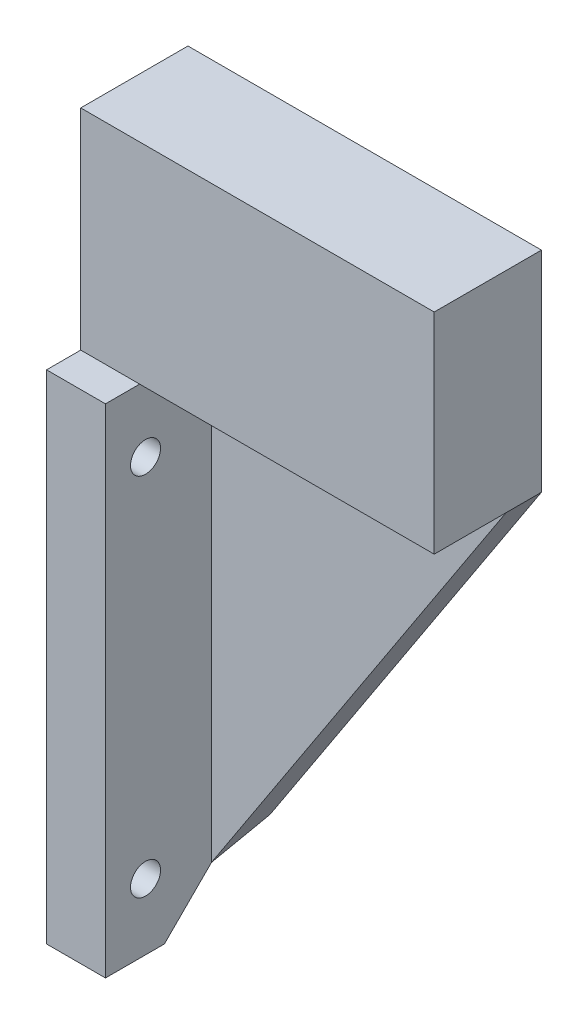
ISO-10303-21;
HEADER;
FILE_DESCRIPTION(('STEP AP214'),'2;1');
FILE_NAME('part.step','',(''),(''),'','','');
FILE_SCHEMA(('AUTOMOTIVE_DESIGN { 1 0 10303 214 1 1 1 1 }'));
ENDSEC;
DATA;
#1=APPLICATION_CONTEXT('core data for automotive mechanical design processes');
#2=APPLICATION_PROTOCOL_DEFINITION('international standard','automotive_design',2000,#1);
#3=PRODUCT_CONTEXT('',#1,'mechanical');
#4=PRODUCT('Part','Part','',(#3));
#5=PRODUCT_RELATED_PRODUCT_CATEGORY('part','',(#4));
#6=PRODUCT_DEFINITION_FORMATION('','',#4);
#7=PRODUCT_DEFINITION_CONTEXT('part definition',#1,'design');
#8=PRODUCT_DEFINITION('design','',#6,#7);
#9=PRODUCT_DEFINITION_SHAPE('','',#8);
#10=(LENGTH_UNIT() NAMED_UNIT(*) SI_UNIT(.MILLI.,.METRE.));
#11=(NAMED_UNIT(*) PLANE_ANGLE_UNIT() SI_UNIT($,.RADIAN.));
#12=(NAMED_UNIT(*) SI_UNIT($,.STERADIAN.) SOLID_ANGLE_UNIT());
#13=UNCERTAINTY_MEASURE_WITH_UNIT(LENGTH_MEASURE(1.E-05),#10,'distance_accuracy_value','');
#14=(GEOMETRIC_REPRESENTATION_CONTEXT(3) GLOBAL_UNCERTAINTY_ASSIGNED_CONTEXT((#13)) GLOBAL_UNIT_ASSIGNED_CONTEXT((#10,
#11,#12)) REPRESENTATION_CONTEXT('',''));
#15=CARTESIAN_POINT('',(0.,0.,0.));
#16=DIRECTION('',(0.,0.,1.));
#17=DIRECTION('',(1.,0.,0.));
#18=AXIS2_PLACEMENT_3D('',#15,#16,#17);
#19=CARTESIAN_POINT('',(5.,-14.8984585562319,-14.8984585562319));
#20=DIRECTION('',(0.,0.707106781186548,0.707106781186548));
#21=DIRECTION('',(0.,-0.707106781186548,0.707106781186548));
#22=AXIS2_PLACEMENT_3D('',#19,#20,#21);
#23=PLANE('',#22);
#24=DIRECTION('',(0.,0.707106781186548,-0.707106781186548));
#25=VECTOR('',#24,1.);
#26=CARTESIAN_POINT('',(0.,-14.8984585562319,-14.8984585562319));
#27=LINE('',#26,#25);
#28=CARTESIAN_POINT('',(0.,-34.1785648404354,4.38164772797147));
#29=VERTEX_POINT('',#28);
#30=CARTESIAN_POINT('',(0.,-27.1795648404353,-2.61735227202852));
#31=VERTEX_POINT('',#30);
#32=EDGE_CURVE('E130',#29,#31,#27,.T.);
#33=ORIENTED_EDGE('',*,*,#32,.T.);
#34=DIRECTION('',(1.,0.,0.));
#35=VECTOR('',#34,1.);
#36=CARTESIAN_POINT('',(-10.,-27.1795648404353,-2.61735227202852));
#37=LINE('',#36,#35);
#38=CARTESIAN_POINT('',(6.96329939006834,-27.1795648404353,-2.61735227202852));
#39=VERTEX_POINT('',#38);
#40=EDGE_CURVE('E132',#31,#39,#37,.T.);
#41=ORIENTED_EDGE('',*,*,#40,.T.);
#42=DIRECTION('',(0.419967470151984,0.641727093091038,-0.641727093091033));
#43=VECTOR('',#42,1.);
#44=CARTESIAN_POINT('',(5.80851351144029,-28.9441238544142,-0.852793258049725));
#45=LINE('',#44,#43);
#46=CARTESIAN_POINT('',(5.,-30.1795648404354,0.382647727971478));
#47=VERTEX_POINT('',#46);
#48=EDGE_CURVE('E148',#47,#39,#45,.T.);
#49=ORIENTED_EDGE('',*,*,#48,.F.);
#50=DIRECTION('',(0.,0.707106781186548,-0.707106781186548));
#51=VECTOR('',#50,1.);
#52=CARTESIAN_POINT('',(5.,-14.8984585562319,-14.8984585562319));
#53=LINE('',#52,#51);
#54=CARTESIAN_POINT('',(5.,-34.1785648404354,4.38164772797147));
#55=VERTEX_POINT('',#54);
#56=EDGE_CURVE('E284',#55,#47,#53,.T.);
#57=ORIENTED_EDGE('',*,*,#56,.F.);
#58=DIRECTION('',(-1.,0.,0.));
#59=VECTOR('',#58,1.);
#60=CARTESIAN_POINT('',(5.,-34.1785648404354,4.38164772797147));
#61=LINE('',#60,#59);
#62=EDGE_CURVE('E135',#55,#29,#61,.T.);
#63=ORIENTED_EDGE('',*,*,#62,.T.);
#64=EDGE_LOOP('',(#33,#41,#49,#57,#63));
#65=FACE_BOUND('',#64,.T.);
#66=ADVANCED_FACE('F45',(#65),#23,.F.);
#67=CARTESIAN_POINT('',(5.,8.02143515956464,0.));
#68=DIRECTION('',(0.,-1.,0.));
#69=DIRECTION('',(0.,0.,-1.));
#70=AXIS2_PLACEMENT_3D('',#67,#68,#69);
#71=PLANE('',#70);
#72=DIRECTION('',(1.,0.,0.));
#73=VECTOR('',#72,1.);
#74=CARTESIAN_POINT('',(30.,8.02143515956464,0.382647727971478));
#75=LINE('',#74,#73);
#76=CARTESIAN_POINT('',(5.00000000000001,8.02143515956464,0.382647727971478));
#77=VERTEX_POINT('',#76);
#78=CARTESIAN_POINT('',(30.,8.02143515956464,0.382647727971478));
#79=VERTEX_POINT('',#78);
#80=EDGE_CURVE('E271',#77,#79,#75,.T.);
#81=ORIENTED_EDGE('',*,*,#80,.T.);
#82=DIRECTION('',(0.,0.,-1.));
#83=VECTOR('',#82,1.);
#84=CARTESIAN_POINT('',(30.,8.02143515956464,6.48264772797147));
#85=LINE('',#84,#83);
#86=CARTESIAN_POINT('',(30.,8.02143515956464,6.48264772797147));
#87=VERTEX_POINT('',#86);
#88=EDGE_CURVE('E304',#87,#79,#85,.T.);
#89=ORIENTED_EDGE('',*,*,#88,.F.);
#90=DIRECTION('',(-1.,0.,0.));
#91=VECTOR('',#90,1.);
#92=CARTESIAN_POINT('',(30.,8.02143515956464,6.48264772797147));
#93=LINE('',#92,#91);
#94=CARTESIAN_POINT('',(5.,8.02143515956464,6.48264772797147));
#95=VERTEX_POINT('',#94);
#96=EDGE_CURVE('E212',#87,#95,#93,.T.);
#97=ORIENTED_EDGE('',*,*,#96,.T.);
#98=DIRECTION('',(0.,0.,-1.));
#99=VECTOR('',#98,1.);
#100=CARTESIAN_POINT('',(5.,8.02143515956464,6.48264772797147));
#101=LINE('',#100,#99);
#102=EDGE_CURVE('E279',#95,#77,#101,.T.);
#103=ORIENTED_EDGE('',*,*,#102,.T.);
#104=EDGE_LOOP('',(#81,#89,#97,#103));
#105=FACE_BOUND('',#104,.T.);
#106=ADVANCED_FACE('F231',(#105),#71,.T.);
#107=CARTESIAN_POINT('',(5.,0.,-2.61735227202852));
#108=DIRECTION('',(0.,0.,1.));
#109=DIRECTION('',(0.,-1.,0.));
#110=AXIS2_PLACEMENT_3D('',#107,#108,#109);
#111=PLANE('',#110);
#112=DIRECTION('',(-0.54759337562062,-0.836744581683332,0.));
#113=VECTOR('',#112,1.);
#114=CARTESIAN_POINT('',(5.,-30.1795648404354,-2.61735227202852));
#115=LINE('',#114,#113);
#116=CARTESIAN_POINT('',(30.,8.02143515956464,-2.61735227202852));
#117=VERTEX_POINT('',#116);
#118=EDGE_CURVE('E146',#117,#39,#115,.T.);
#119=ORIENTED_EDGE('',*,*,#118,.T.);
#120=ORIENTED_EDGE('',*,*,#40,.F.);
#121=DIRECTION('',(0.,1.,0.));
#122=VECTOR('',#121,1.);
#123=CARTESIAN_POINT('',(0.,0.,-2.61735227202852));
#124=LINE('',#123,#122);
#125=CARTESIAN_POINT('',(0.,25.8214351595647,-2.61735227202852));
#126=VERTEX_POINT('',#125);
#127=EDGE_CURVE('E139',#31,#126,#124,.T.);
#128=ORIENTED_EDGE('',*,*,#127,.T.);
#129=DIRECTION('',(-1.,0.,0.));
#130=VECTOR('',#129,1.);
#131=CARTESIAN_POINT('',(5.,25.8214351595647,-2.61735227202852));
#132=LINE('',#131,#130);
#133=CARTESIAN_POINT('',(30.,25.8214351595647,-2.61735227202852));
#134=VERTEX_POINT('',#133);
#135=EDGE_CURVE('E11',#134,#126,#132,.T.);
#136=ORIENTED_EDGE('',*,*,#135,.F.);
#137=DIRECTION('',(0.,1.,0.));
#138=VECTOR('',#137,1.);
#139=CARTESIAN_POINT('',(30.,25.8214351595647,-2.61735227202852));
#140=LINE('',#139,#138);
#141=EDGE_CURVE('E300',#117,#134,#140,.T.);
#142=ORIENTED_EDGE('',*,*,#141,.F.);
#143=EDGE_LOOP('',(#119,#120,#128,#136,#142));
#144=FACE_BOUND('',#143,.T.);
#145=ADVANCED_FACE('F144',(#144),#111,.F.);
#146=CARTESIAN_POINT('',(5.,25.8214351595647,0.));
#147=DIRECTION('',(0.,-1.,0.));
#148=DIRECTION('',(0.,0.,-1.));
#149=AXIS2_PLACEMENT_3D('',#146,#147,#148);
#150=PLANE('',#149);
#151=DIRECTION('',(0.,0.,1.));
#152=VECTOR('',#151,1.);
#153=CARTESIAN_POINT('',(0.,25.8214351595647,0.));
#154=LINE('',#153,#152);
#155=CARTESIAN_POINT('',(0.,25.8214351595647,6.48264772797147));
#156=VERTEX_POINT('',#155);
#157=EDGE_CURVE('E153',#126,#156,#154,.T.);
#158=ORIENTED_EDGE('',*,*,#157,.T.);
#159=DIRECTION('',(-1.,0.,0.));
#160=VECTOR('',#159,1.);
#161=CARTESIAN_POINT('',(5.,25.8214351595647,6.48264772797147));
#162=LINE('',#161,#160);
#163=CARTESIAN_POINT('',(30.,25.8214351595647,6.48264772797147));
#164=VERTEX_POINT('',#163);
#165=EDGE_CURVE('E55',#164,#156,#162,.T.);
#166=ORIENTED_EDGE('',*,*,#165,.F.);
#167=DIRECTION('',(0.,0.,1.));
#168=VECTOR('',#167,1.);
#169=CARTESIAN_POINT('',(30.,25.8214351595647,6.48264772797147));
#170=LINE('',#169,#168);
#171=EDGE_CURVE('E296',#134,#164,#170,.T.);
#172=ORIENTED_EDGE('',*,*,#171,.F.);
#173=ORIENTED_EDGE('',*,*,#135,.T.);
#174=EDGE_LOOP('',(#158,#166,#172,#173));
#175=FACE_BOUND('',#174,.T.);
#176=ADVANCED_FACE('F240',(#175),#150,.F.);
#177=CARTESIAN_POINT('',(5.,0.,6.48264772797147));
#178=DIRECTION('',(0.,0.,-1.));
#179=DIRECTION('',(-1.,0.,0.));
#180=AXIS2_PLACEMENT_3D('',#177,#178,#179);
#181=PLANE('',#180);
#182=DIRECTION('',(0.,-1.,0.));
#183=VECTOR('',#182,1.);
#184=CARTESIAN_POINT('',(0.,0.,6.48264772797147));
#185=LINE('',#184,#183);
#186=CARTESIAN_POINT('',(0.,8.02143515956464,6.48264772797147));
#187=VERTEX_POINT('',#186);
#188=EDGE_CURVE('E157',#156,#187,#185,.T.);
#189=ORIENTED_EDGE('',*,*,#188,.T.);
#190=DIRECTION('',(-1.,0.,0.));
#191=VECTOR('',#190,1.);
#192=CARTESIAN_POINT('',(5.,8.02143515956464,6.48264772797147));
#193=LINE('',#192,#191);
#194=EDGE_CURVE('E179',#95,#187,#193,.T.);
#195=ORIENTED_EDGE('',*,*,#194,.F.);
#196=ORIENTED_EDGE('',*,*,#96,.F.);
#197=DIRECTION('',(0.,-1.,0.));
#198=VECTOR('',#197,1.);
#199=CARTESIAN_POINT('',(30.,25.8214351595647,6.48264772797147));
#200=LINE('',#199,#198);
#201=EDGE_CURVE('E190',#164,#87,#200,.T.);
#202=ORIENTED_EDGE('',*,*,#201,.F.);
#203=ORIENTED_EDGE('',*,*,#165,.T.);
#204=EDGE_LOOP('',(#189,#195,#196,#202,#203));
#205=FACE_BOUND('',#204,.T.);
#206=ADVANCED_FACE('F186',(#205),#181,.F.);
#207=CARTESIAN_POINT('',(5.,8.02143515956464,0.));
#208=DIRECTION('',(0.,-1.,0.));
#209=DIRECTION('',(0.,0.,-1.));
#210=AXIS2_PLACEMENT_3D('',#207,#208,#209);
#211=PLANE('',#210);
#212=DIRECTION('',(0.,0.,1.));
#213=VECTOR('',#212,1.);
#214=CARTESIAN_POINT('',(0.,8.02143515956464,0.));
#215=LINE('',#214,#213);
#216=CARTESIAN_POINT('',(0.,8.02143515956464,9.38264772797147));
#217=VERTEX_POINT('',#216);
#218=EDGE_CURVE('E163',#187,#217,#215,.T.);
#219=ORIENTED_EDGE('',*,*,#218,.T.);
#220=DIRECTION('',(-1.,0.,0.));
#221=VECTOR('',#220,1.);
#222=CARTESIAN_POINT('',(5.,8.02143515956464,9.38264772797147));
#223=LINE('',#222,#221);
#224=CARTESIAN_POINT('',(5.,8.02143515956464,9.38264772797147));
#225=VERTEX_POINT('',#224);
#226=EDGE_CURVE('E176',#225,#217,#223,.T.);
#227=ORIENTED_EDGE('',*,*,#226,.F.);
#228=DIRECTION('',(0.,0.,1.));
#229=VECTOR('',#228,1.);
#230=CARTESIAN_POINT('',(5.,8.02143515956464,0.));
#231=LINE('',#230,#229);
#232=EDGE_CURVE('E97',#95,#225,#231,.T.);
#233=ORIENTED_EDGE('',*,*,#232,.F.);
#234=ORIENTED_EDGE('',*,*,#194,.T.);
#235=EDGE_LOOP('',(#219,#227,#233,#234));
#236=FACE_BOUND('',#235,.T.);
#237=ADVANCED_FACE('F196',(#236),#211,.F.);
#238=CARTESIAN_POINT('',(5.,0.,9.38264772797147));
#239=DIRECTION('',(0.,0.,-1.));
#240=DIRECTION('',(0.,1.,0.));
#241=AXIS2_PLACEMENT_3D('',#238,#239,#240);
#242=PLANE('',#241);
#243=DIRECTION('',(0.,-1.,0.));
#244=VECTOR('',#243,1.);
#245=CARTESIAN_POINT('',(0.,0.,9.38264772797147));
#246=LINE('',#245,#244);
#247=CARTESIAN_POINT('',(0.,-34.1785648404354,9.38264772797148));
#248=VERTEX_POINT('',#247);
#249=EDGE_CURVE('E87',#217,#248,#246,.T.);
#250=ORIENTED_EDGE('',*,*,#249,.T.);
#251=DIRECTION('',(-1.,0.,0.));
#252=VECTOR('',#251,1.);
#253=CARTESIAN_POINT('',(5.,-34.1785648404354,9.38264772797148));
#254=LINE('',#253,#252);
#255=CARTESIAN_POINT('',(5.,-34.1785648404354,9.38264772797148));
#256=VERTEX_POINT('',#255);
#257=EDGE_CURVE('E173',#256,#248,#254,.T.);
#258=ORIENTED_EDGE('',*,*,#257,.F.);
#259=DIRECTION('',(0.,-1.,0.));
#260=VECTOR('',#259,1.);
#261=CARTESIAN_POINT('',(5.,0.,9.38264772797147));
#262=LINE('',#261,#260);
#263=EDGE_CURVE('E199',#225,#256,#262,.T.);
#264=ORIENTED_EDGE('',*,*,#263,.F.);
#265=ORIENTED_EDGE('',*,*,#226,.T.);
#266=EDGE_LOOP('',(#250,#258,#264,#265));
#267=FACE_BOUND('',#266,.T.);
#268=ADVANCED_FACE('F198',(#267),#242,.F.);
#269=CARTESIAN_POINT('',(5.,-28.5785648404354,5.98264772797147));
#270=DIRECTION('',(-1.,0.,0.));
#271=DIRECTION('',(0.,0.,1.));
#272=AXIS2_PLACEMENT_3D('',#269,#270,#271);
#273=CYLINDRICAL_SURFACE('',#272,1.275);
#274=CARTESIAN_POINT('',(5.,-28.5785648404354,5.98264772797147));
#275=DIRECTION('',(1.,0.,0.));
#276=DIRECTION('',(0.,0.,-1.));
#277=AXIS2_PLACEMENT_3D('',#274,#275,#276);
#278=CIRCLE('',#277,1.275);
#279=CARTESIAN_POINT('',(5.,-28.5785648404354,4.70764772797147));
#280=VERTEX_POINT('',#279);
#281=EDGE_CURVE('E287',#280,#280,#278,.T.);
#282=ORIENTED_EDGE('',*,*,#281,.T.);
#283=EDGE_LOOP('',(#282));
#284=FACE_BOUND('',#283,.T.);
#285=CARTESIAN_POINT('',(0.,-28.5785648404354,5.98264772797147));
#286=DIRECTION('',(1.,0.,0.));
#287=DIRECTION('',(0.,0.,-1.));
#288=AXIS2_PLACEMENT_3D('',#285,#286,#287);
#289=CIRCLE('',#288,1.275);
#290=CARTESIAN_POINT('',(0.,-28.5785648404354,4.70764772797147));
#291=VERTEX_POINT('',#290);
#292=EDGE_CURVE('E140',#291,#291,#289,.T.);
#293=ORIENTED_EDGE('',*,*,#292,.F.);
#294=EDGE_LOOP('',(#293));
#295=FACE_BOUND('',#294,.T.);
#296=ADVANCED_FACE('F218',(#284,#295),#273,.F.);
#297=CARTESIAN_POINT('',(5.,2.42143515956463,5.98264772797147));
#298=DIRECTION('',(-1.,0.,0.));
#299=DIRECTION('',(0.,0.,1.));
#300=AXIS2_PLACEMENT_3D('',#297,#298,#299);
#301=CYLINDRICAL_SURFACE('',#300,1.275);
#302=CARTESIAN_POINT('',(5.,2.42143515956463,5.98264772797147));
#303=DIRECTION('',(1.,0.,0.));
#304=DIRECTION('',(0.,0.,-1.));
#305=AXIS2_PLACEMENT_3D('',#302,#303,#304);
#306=CIRCLE('',#305,1.275);
#307=CARTESIAN_POINT('',(5.,2.42143515956463,4.70764772797147));
#308=VERTEX_POINT('',#307);
#309=EDGE_CURVE('E170',#308,#308,#306,.T.);
#310=ORIENTED_EDGE('',*,*,#309,.T.);
#311=EDGE_LOOP('',(#310));
#312=FACE_BOUND('',#311,.T.);
#313=CARTESIAN_POINT('',(0.,2.42143515956463,5.98264772797147));
#314=DIRECTION('',(1.,0.,0.));
#315=DIRECTION('',(0.,0.,-1.));
#316=AXIS2_PLACEMENT_3D('',#313,#314,#315);
#317=CIRCLE('',#316,1.275);
#318=CARTESIAN_POINT('',(0.,2.42143515956463,4.70764772797147));
#319=VERTEX_POINT('',#318);
#320=EDGE_CURVE('E209',#319,#319,#317,.T.);
#321=ORIENTED_EDGE('',*,*,#320,.F.);
#322=EDGE_LOOP('',(#321));
#323=FACE_BOUND('',#322,.T.);
#324=ADVANCED_FACE('F47',(#312,#323),#301,.F.);
#325=CARTESIAN_POINT('',(5.,-34.1785648404354,0.));
#326=DIRECTION('',(0.,1.,0.));
#327=DIRECTION('',(0.,0.,1.));
#328=AXIS2_PLACEMENT_3D('',#325,#326,#327);
#329=PLANE('',#328);
#330=DIRECTION('',(0.,0.,-1.));
#331=VECTOR('',#330,1.);
#332=CARTESIAN_POINT('',(0.,-34.1785648404354,0.));
#333=LINE('',#332,#331);
#334=EDGE_CURVE('E92',#248,#29,#333,.T.);
#335=ORIENTED_EDGE('',*,*,#334,.T.);
#336=ORIENTED_EDGE('',*,*,#62,.F.);
#337=DIRECTION('',(0.,0.,-1.));
#338=VECTOR('',#337,1.);
#339=CARTESIAN_POINT('',(5.,-34.1785648404354,0.));
#340=LINE('',#339,#338);
#341=EDGE_CURVE('E63',#256,#55,#340,.T.);
#342=ORIENTED_EDGE('',*,*,#341,.F.);
#343=ORIENTED_EDGE('',*,*,#257,.T.);
#344=EDGE_LOOP('',(#335,#336,#342,#343));
#345=FACE_BOUND('',#344,.T.);
#346=ADVANCED_FACE('F225',(#345),#329,.F.);
#347=CARTESIAN_POINT('',(5.,0.,0.));
#348=DIRECTION('',(1.,0.,0.));
#349=DIRECTION('',(0.,0.,-1.));
#350=AXIS2_PLACEMENT_3D('',#347,#348,#349);
#351=PLANE('',#350);
#352=ORIENTED_EDGE('',*,*,#102,.F.);
#353=ORIENTED_EDGE('',*,*,#232,.T.);
#354=ORIENTED_EDGE('',*,*,#263,.T.);
#355=ORIENTED_EDGE('',*,*,#341,.T.);
#356=ORIENTED_EDGE('',*,*,#56,.T.);
#357=DIRECTION('',(0.,1.,0.));
#358=VECTOR('',#357,1.);
#359=CARTESIAN_POINT('',(5.,0.,0.382647727971478));
#360=LINE('',#359,#358);
#361=EDGE_CURVE('E205',#47,#77,#360,.T.);
#362=ORIENTED_EDGE('',*,*,#361,.T.);
#363=EDGE_LOOP('',(#352,#353,#354,#355,#356,#362));
#364=FACE_BOUND('',#363,.T.);
#365=ORIENTED_EDGE('',*,*,#309,.F.);
#366=EDGE_LOOP('',(#365));
#367=FACE_BOUND('',#366,.T.);
#368=ORIENTED_EDGE('',*,*,#281,.F.);
#369=EDGE_LOOP('',(#368));
#370=FACE_BOUND('',#369,.T.);
#371=ADVANCED_FACE('F249',(#364,#367,#370),#351,.T.);
#372=CARTESIAN_POINT('',(0.,0.,0.));
#373=DIRECTION('',(1.,0.,0.));
#374=DIRECTION('',(0.,0.,-1.));
#375=AXIS2_PLACEMENT_3D('',#372,#373,#374);
#376=PLANE('',#375);
#377=ORIENTED_EDGE('',*,*,#320,.T.);
#378=EDGE_LOOP('',(#377));
#379=FACE_BOUND('',#378,.T.);
#380=ORIENTED_EDGE('',*,*,#292,.T.);
#381=EDGE_LOOP('',(#380));
#382=FACE_BOUND('',#381,.T.);
#383=ORIENTED_EDGE('',*,*,#127,.F.);
#384=ORIENTED_EDGE('',*,*,#32,.F.);
#385=ORIENTED_EDGE('',*,*,#334,.F.);
#386=ORIENTED_EDGE('',*,*,#249,.F.);
#387=ORIENTED_EDGE('',*,*,#218,.F.);
#388=ORIENTED_EDGE('',*,*,#188,.F.);
#389=ORIENTED_EDGE('',*,*,#157,.F.);
#390=EDGE_LOOP('',(#383,#384,#385,#386,#387,#388,#389));
#391=FACE_BOUND('',#390,.T.);
#392=ADVANCED_FACE('F151',(#379,#382,#391),#376,.F.);
#393=CARTESIAN_POINT('',(30.,0.,0.));
#394=DIRECTION('',(1.,0.,0.));
#395=DIRECTION('',(0.,0.,-1.));
#396=AXIS2_PLACEMENT_3D('',#393,#394,#395);
#397=PLANE('',#396);
#398=ORIENTED_EDGE('',*,*,#201,.T.);
#399=ORIENTED_EDGE('',*,*,#88,.T.);
#400=DIRECTION('',(0.,0.,1.));
#401=VECTOR('',#400,1.);
#402=CARTESIAN_POINT('',(30.,8.02143515956464,-2.61735227202852));
#403=LINE('',#402,#401);
#404=EDGE_CURVE('E281',#117,#79,#403,.T.);
#405=ORIENTED_EDGE('',*,*,#404,.F.);
#406=ORIENTED_EDGE('',*,*,#141,.T.);
#407=ORIENTED_EDGE('',*,*,#171,.T.);
#408=EDGE_LOOP('',(#398,#399,#405,#406,#407));
#409=FACE_BOUND('',#408,.T.);
#410=ADVANCED_FACE('F252',(#409),#397,.T.);
#411=CARTESIAN_POINT('',(5.,-30.1795648404354,-2.61735227202852));
#412=DIRECTION('',(-0.836744581683332,0.54759337562062,0.));
#413=DIRECTION('',(-0.54759337562062,-0.836744581683332,0.));
#414=AXIS2_PLACEMENT_3D('',#411,#412,#413);
#415=PLANE('',#414);
#416=DIRECTION('',(-0.54759337562062,-0.836744581683332,0.));
#417=VECTOR('',#416,1.);
#418=CARTESIAN_POINT('',(5.,-30.1795648404354,0.382647727971478));
#419=LINE('',#418,#417);
#420=EDGE_CURVE('E275',#79,#47,#419,.T.);
#421=ORIENTED_EDGE('',*,*,#420,.T.);
#422=ORIENTED_EDGE('',*,*,#48,.T.);
#423=ORIENTED_EDGE('',*,*,#118,.F.);
#424=ORIENTED_EDGE('',*,*,#404,.T.);
#425=EDGE_LOOP('',(#421,#422,#423,#424));
#426=FACE_BOUND('',#425,.T.);
#427=ADVANCED_FACE('F258',(#426),#415,.F.);
#428=CARTESIAN_POINT('',(0.,0.,0.382647727971478));
#429=DIRECTION('',(0.,0.,1.));
#430=DIRECTION('',(1.,0.,0.));
#431=AXIS2_PLACEMENT_3D('',#428,#429,#430);
#432=PLANE('',#431);
#433=ORIENTED_EDGE('',*,*,#80,.F.);
#434=ORIENTED_EDGE('',*,*,#361,.F.);
#435=ORIENTED_EDGE('',*,*,#420,.F.);
#436=EDGE_LOOP('',(#433,#434,#435));
#437=FACE_BOUND('',#436,.T.);
#438=ADVANCED_FACE('F262',(#437),#432,.T.);
#439=CLOSED_SHELL('',(#66,#106,#145,#176,#206,#237,#268,#296,#324,#346,#371,#392,#410,#427,#438));
#440=MANIFOLD_SOLID_BREP('B2',#439);
#441=ADVANCED_BREP_SHAPE_REPRESENTATION('',(#18,#440),#14);
#442=SHAPE_DEFINITION_REPRESENTATION(#9,#441);
ENDSEC;
END-ISO-10303-21;
